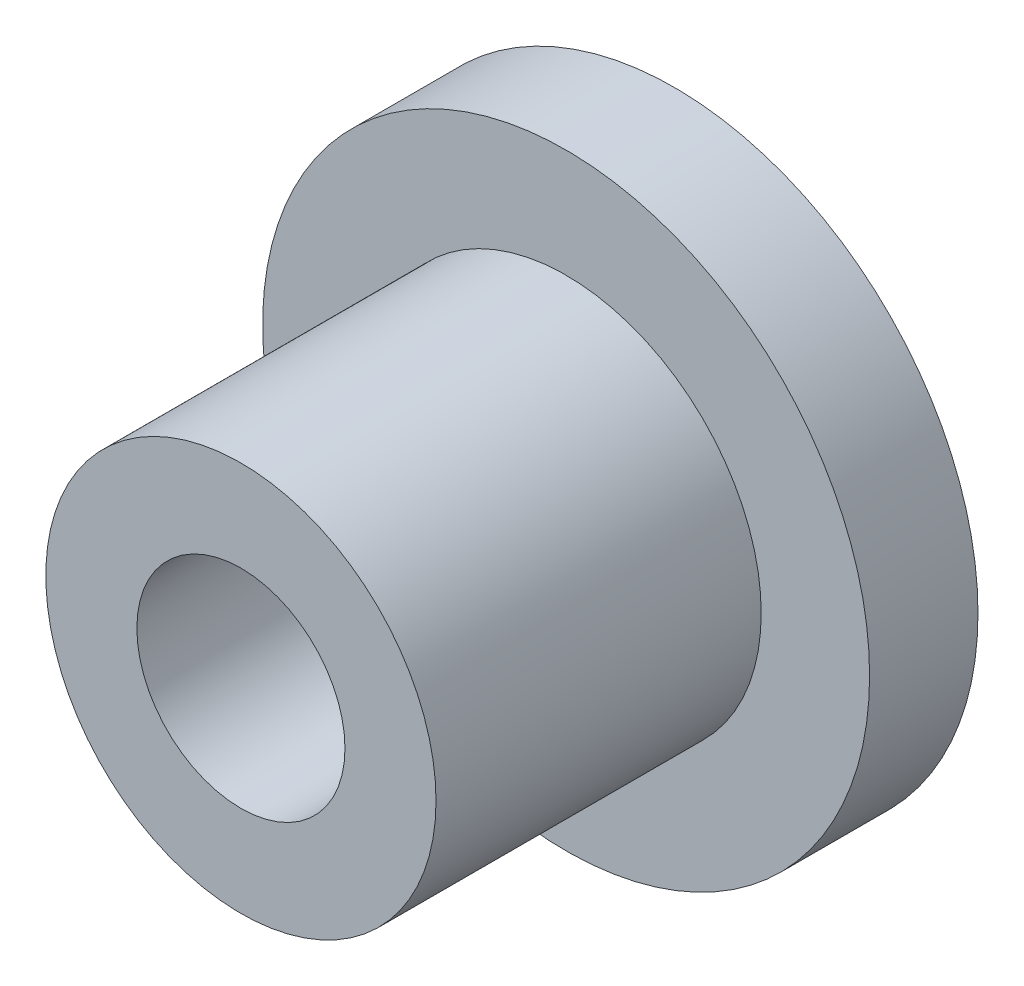
ISO-10303-21;
HEADER;
FILE_DESCRIPTION(('STEP AP214'),'2;1');
FILE_NAME('part.step','',(''),(''),'','','');
FILE_SCHEMA(('AUTOMOTIVE_DESIGN { 1 0 10303 214 1 1 1 1 }'));
ENDSEC;
DATA;
#1=APPLICATION_CONTEXT('core data for automotive mechanical design processes');
#2=APPLICATION_PROTOCOL_DEFINITION('international standard','automotive_design',2000,#1);
#3=PRODUCT_CONTEXT('',#1,'mechanical');
#4=PRODUCT('Part','Part','',(#3));
#5=PRODUCT_RELATED_PRODUCT_CATEGORY('part','',(#4));
#6=PRODUCT_DEFINITION_FORMATION('','',#4);
#7=PRODUCT_DEFINITION_CONTEXT('part definition',#1,'design');
#8=PRODUCT_DEFINITION('design','',#6,#7);
#9=PRODUCT_DEFINITION_SHAPE('','',#8);
#10=(LENGTH_UNIT() NAMED_UNIT(*) SI_UNIT(.MILLI.,.METRE.));
#11=(NAMED_UNIT(*) PLANE_ANGLE_UNIT() SI_UNIT($,.RADIAN.));
#12=(NAMED_UNIT(*) SI_UNIT($,.STERADIAN.) SOLID_ANGLE_UNIT());
#13=UNCERTAINTY_MEASURE_WITH_UNIT(LENGTH_MEASURE(1.E-05),#10,'distance_accuracy_value','');
#14=(GEOMETRIC_REPRESENTATION_CONTEXT(3) GLOBAL_UNCERTAINTY_ASSIGNED_CONTEXT((#13)) GLOBAL_UNIT_ASSIGNED_CONTEXT((#10,
#11,#12)) REPRESENTATION_CONTEXT('',''));
#15=CARTESIAN_POINT('',(0.,0.,0.));
#16=DIRECTION('',(0.,0.,1.));
#17=DIRECTION('',(1.,0.,0.));
#18=AXIS2_PLACEMENT_3D('',#15,#16,#17);
#19=CARTESIAN_POINT('',(0.,0.,2.5));
#20=DIRECTION('',(0.,0.,-1.));
#21=DIRECTION('',(-1.,0.,0.));
#22=AXIS2_PLACEMENT_3D('',#19,#20,#21);
#23=CYLINDRICAL_SURFACE('',#22,7.);
#24=CARTESIAN_POINT('',(0.,0.,2.5));
#25=DIRECTION('',(0.,0.,1.));
#26=DIRECTION('',(1.,0.,0.));
#27=AXIS2_PLACEMENT_3D('',#24,#25,#26);
#28=CIRCLE('',#27,7.);
#29=CARTESIAN_POINT('',(7.,0.,2.5));
#30=VERTEX_POINT('',#29);
#31=EDGE_CURVE('E43',#30,#30,#28,.T.);
#32=ORIENTED_EDGE('',*,*,#31,.F.);
#33=EDGE_LOOP('',(#32));
#34=FACE_BOUND('',#33,.T.);
#35=CARTESIAN_POINT('',(0.,0.,0.));
#36=DIRECTION('',(0.,0.,1.));
#37=DIRECTION('',(1.,0.,0.));
#38=AXIS2_PLACEMENT_3D('',#35,#36,#37);
#39=CIRCLE('',#38,7.);
#40=CARTESIAN_POINT('',(7.,0.,0.));
#41=VERTEX_POINT('',#40);
#42=EDGE_CURVE('E39',#41,#41,#39,.T.);
#43=ORIENTED_EDGE('',*,*,#42,.T.);
#44=EDGE_LOOP('',(#43));
#45=FACE_BOUND('',#44,.T.);
#46=ADVANCED_FACE('F36',(#34,#45),#23,.T.);
#47=CARTESIAN_POINT('',(0.,0.,2.5));
#48=DIRECTION('',(0.,0.,1.));
#49=DIRECTION('',(1.,0.,0.));
#50=AXIS2_PLACEMENT_3D('',#47,#48,#49);
#51=PLANE('',#50);
#52=CARTESIAN_POINT('',(0.,0.,2.5));
#53=DIRECTION('',(0.,0.,1.));
#54=DIRECTION('',(1.,0.,0.));
#55=AXIS2_PLACEMENT_3D('',#52,#53,#54);
#56=CIRCLE('',#55,4.5);
#57=CARTESIAN_POINT('',(4.5,0.,2.5));
#58=VERTEX_POINT('',#57);
#59=EDGE_CURVE('E10',#58,#58,#56,.T.);
#60=ORIENTED_EDGE('',*,*,#59,.F.);
#61=EDGE_LOOP('',(#60));
#62=FACE_BOUND('',#61,.T.);
#63=ORIENTED_EDGE('',*,*,#31,.T.);
#64=EDGE_LOOP('',(#63));
#65=FACE_BOUND('',#64,.T.);
#66=ADVANCED_FACE('F81',(#62,#65),#51,.T.);
#67=CARTESIAN_POINT('',(0.,0.,0.));
#68=DIRECTION('',(0.,0.,1.));
#69=DIRECTION('',(1.,0.,0.));
#70=AXIS2_PLACEMENT_3D('',#67,#68,#69);
#71=PLANE('',#70);
#72=ORIENTED_EDGE('',*,*,#42,.F.);
#73=EDGE_LOOP('',(#72));
#74=FACE_BOUND('',#73,.T.);
#75=ADVANCED_FACE('F75',(#74),#71,.F.);
#76=CARTESIAN_POINT('',(0.,0.,10.));
#77=DIRECTION('',(0.,0.,-1.));
#78=DIRECTION('',(-1.,0.,0.));
#79=AXIS2_PLACEMENT_3D('',#76,#77,#78);
#80=CYLINDRICAL_SURFACE('',#79,4.5);
#81=CARTESIAN_POINT('',(0.,0.,10.));
#82=DIRECTION('',(0.,0.,1.));
#83=DIRECTION('',(1.,0.,0.));
#84=AXIS2_PLACEMENT_3D('',#81,#82,#83);
#85=CIRCLE('',#84,4.5);
#86=CARTESIAN_POINT('',(4.5,0.,10.));
#87=VERTEX_POINT('',#86);
#88=EDGE_CURVE('E49',#87,#87,#85,.T.);
#89=ORIENTED_EDGE('',*,*,#88,.F.);
#90=EDGE_LOOP('',(#89));
#91=FACE_BOUND('',#90,.T.);
#92=ORIENTED_EDGE('',*,*,#59,.T.);
#93=EDGE_LOOP('',(#92));
#94=FACE_BOUND('',#93,.T.);
#95=ADVANCED_FACE('F70',(#91,#94),#80,.T.);
#96=CARTESIAN_POINT('',(0.,0.,10.));
#97=DIRECTION('',(0.,0.,1.));
#98=DIRECTION('',(1.,0.,0.));
#99=AXIS2_PLACEMENT_3D('',#96,#97,#98);
#100=PLANE('',#99);
#101=CARTESIAN_POINT('',(0.,0.,10.));
#102=DIRECTION('',(0.,0.,1.));
#103=DIRECTION('',(1.,0.,0.));
#104=AXIS2_PLACEMENT_3D('',#101,#102,#103);
#105=CIRCLE('',#104,2.4);
#106=CARTESIAN_POINT('',(2.4,0.,10.));
#107=VERTEX_POINT('',#106);
#108=EDGE_CURVE('E53',#107,#107,#105,.T.);
#109=ORIENTED_EDGE('',*,*,#108,.F.);
#110=EDGE_LOOP('',(#109));
#111=FACE_BOUND('',#110,.T.);
#112=ORIENTED_EDGE('',*,*,#88,.T.);
#113=EDGE_LOOP('',(#112));
#114=FACE_BOUND('',#113,.T.);
#115=ADVANCED_FACE('F64',(#111,#114),#100,.T.);
#116=CARTESIAN_POINT('',(0.,0.,5.));
#117=DIRECTION('',(0.,0.,1.));
#118=DIRECTION('',(1.,0.,0.));
#119=AXIS2_PLACEMENT_3D('',#116,#117,#118);
#120=CYLINDRICAL_SURFACE('',#119,2.4);
#121=CARTESIAN_POINT('',(0.,0.,5.));
#122=DIRECTION('',(0.,0.,1.));
#123=DIRECTION('',(1.,0.,0.));
#124=AXIS2_PLACEMENT_3D('',#121,#122,#123);
#125=CIRCLE('',#124,2.4);
#126=CARTESIAN_POINT('',(2.4,0.,5.));
#127=VERTEX_POINT('',#126);
#128=EDGE_CURVE('E52',#127,#127,#125,.T.);
#129=ORIENTED_EDGE('',*,*,#128,.F.);
#130=EDGE_LOOP('',(#129));
#131=FACE_BOUND('',#130,.T.);
#132=ORIENTED_EDGE('',*,*,#108,.T.);
#133=EDGE_LOOP('',(#132));
#134=FACE_BOUND('',#133,.T.);
#135=ADVANCED_FACE('F61',(#131,#134),#120,.F.);
#136=CARTESIAN_POINT('',(0.,0.,5.));
#137=DIRECTION('',(0.,0.,1.));
#138=DIRECTION('',(1.,0.,0.));
#139=AXIS2_PLACEMENT_3D('',#136,#137,#138);
#140=PLANE('',#139);
#141=ORIENTED_EDGE('',*,*,#128,.T.);
#142=EDGE_LOOP('',(#141));
#143=FACE_BOUND('',#142,.T.);
#144=ADVANCED_FACE('F59',(#143),#140,.T.);
#145=CLOSED_SHELL('',(#46,#66,#75,#95,#115,#135,#144));
#146=MANIFOLD_SOLID_BREP('B2',#145);
#147=ADVANCED_BREP_SHAPE_REPRESENTATION('',(#18,#146),#14);
#148=SHAPE_DEFINITION_REPRESENTATION(#9,#147);
ENDSEC;
END-ISO-10303-21;
